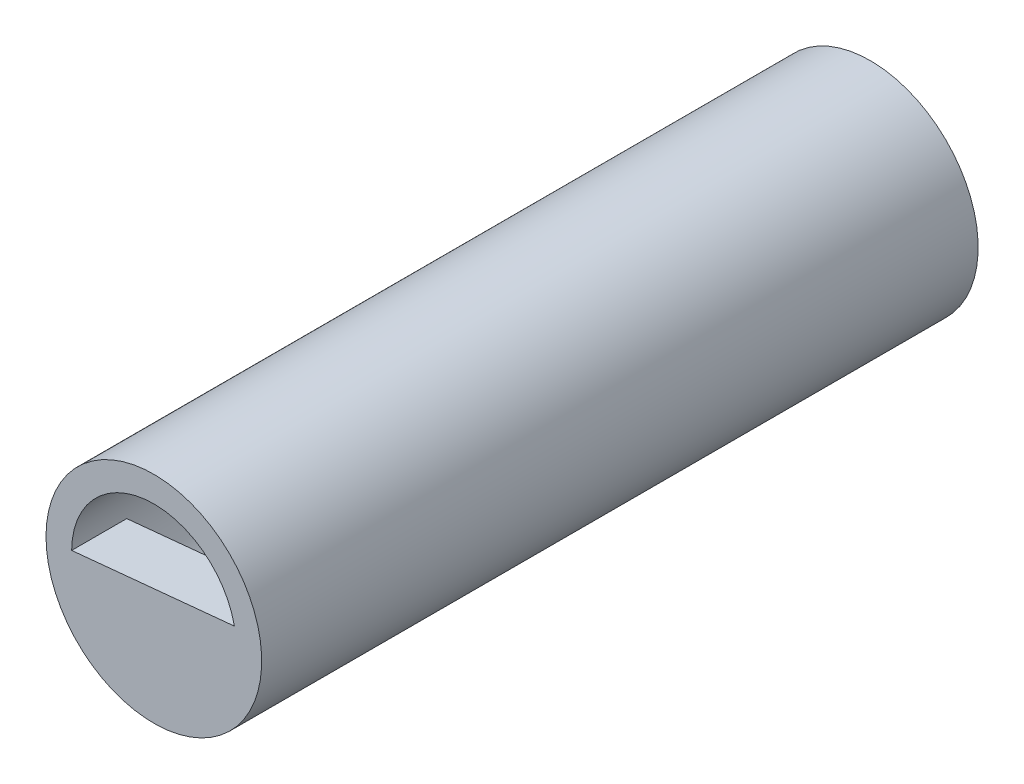
ISO-10303-21;
HEADER;
FILE_DESCRIPTION(('STEP AP214'),'2;1');
FILE_NAME('part.step','',(''),(''),'','','');
FILE_SCHEMA(('AUTOMOTIVE_DESIGN { 1 0 10303 214 1 1 1 1 }'));
ENDSEC;
DATA;
#1=APPLICATION_CONTEXT('core data for automotive mechanical design processes');
#2=APPLICATION_PROTOCOL_DEFINITION('international standard','automotive_design',2000,#1);
#3=PRODUCT_CONTEXT('',#1,'mechanical');
#4=PRODUCT('Part','Part','',(#3));
#5=PRODUCT_RELATED_PRODUCT_CATEGORY('part','',(#4));
#6=PRODUCT_DEFINITION_FORMATION('','',#4);
#7=PRODUCT_DEFINITION_CONTEXT('part definition',#1,'design');
#8=PRODUCT_DEFINITION('design','',#6,#7);
#9=PRODUCT_DEFINITION_SHAPE('','',#8);
#10=(LENGTH_UNIT() NAMED_UNIT(*) SI_UNIT(.MILLI.,.METRE.));
#11=(NAMED_UNIT(*) PLANE_ANGLE_UNIT() SI_UNIT($,.RADIAN.));
#12=(NAMED_UNIT(*) SI_UNIT($,.STERADIAN.) SOLID_ANGLE_UNIT());
#13=UNCERTAINTY_MEASURE_WITH_UNIT(LENGTH_MEASURE(1.E-05),#10,'distance_accuracy_value','');
#14=(GEOMETRIC_REPRESENTATION_CONTEXT(3) GLOBAL_UNCERTAINTY_ASSIGNED_CONTEXT((#13)) GLOBAL_UNIT_ASSIGNED_CONTEXT((#10,
#11,#12)) REPRESENTATION_CONTEXT('',''));
#15=CARTESIAN_POINT('',(0.,0.,0.));
#16=DIRECTION('',(0.,0.,1.));
#17=DIRECTION('',(1.,0.,0.));
#18=AXIS2_PLACEMENT_3D('',#15,#16,#17);
#19=CARTESIAN_POINT('',(0.,0.,304.8));
#20=DIRECTION('',(0.,0.,1.));
#21=DIRECTION('',(1.,0.,0.));
#22=AXIS2_PLACEMENT_3D('',#19,#20,#21);
#23=PLANE('',#22);
#24=CARTESIAN_POINT('',(0.,0.,304.8));
#25=DIRECTION('',(0.,0.,1.));
#26=DIRECTION('',(1.,0.,0.));
#27=AXIS2_PLACEMENT_3D('',#24,#25,#26);
#28=CIRCLE('',#27,49.7047479179537);
#29=CARTESIAN_POINT('',(-49.7047479179537,0.,304.8));
#30=VERTEX_POINT('',#29);
#31=EDGE_CURVE('E11',#30,#30,#28,.T.);
#32=ORIENTED_EDGE('',*,*,#31,.T.);
#33=EDGE_LOOP('',(#32));
#34=FACE_BOUND('',#33,.T.);
#35=CARTESIAN_POINT('',(0.,0.,304.8));
#36=DIRECTION('',(0.,0.,1.));
#37=DIRECTION('',(1.,0.,0.));
#38=AXIS2_PLACEMENT_3D('',#35,#36,#37);
#39=CIRCLE('',#38,37.8963787723686);
#40=CARTESIAN_POINT('',(37.1168710063061,7.64679087984369,304.8));
#41=VERTEX_POINT('',#40);
#42=CARTESIAN_POINT('',(-37.894810183845,0.344797316092374,304.8));
#43=VERTEX_POINT('',#42);
#44=EDGE_CURVE('E53',#41,#43,#39,.T.);
#45=ORIENTED_EDGE('',*,*,#44,.F.);
#46=DIRECTION('',(-0.99529540880386,-0.0968867855486918,0.));
#47=VECTOR('',#46,1.);
#48=CARTESIAN_POINT('',(-0.388969588769448,3.99579409796803,304.8));
#49=LINE('',#48,#47);
#50=EDGE_CURVE('E73',#41,#43,#49,.T.);
#51=ORIENTED_EDGE('',*,*,#50,.T.);
#52=EDGE_LOOP('',(#45,#51));
#53=FACE_BOUND('',#52,.T.);
#54=ADVANCED_FACE('F45',(#34,#53),#23,.T.);
#55=CARTESIAN_POINT('',(0.,0.,304.8));
#56=DIRECTION('',(0.,0.,-1.));
#57=DIRECTION('',(-1.,0.,0.));
#58=AXIS2_PLACEMENT_3D('',#55,#56,#57);
#59=CYLINDRICAL_SURFACE('',#58,49.7047479179537);
#60=CARTESIAN_POINT('',(0.,0.,-25.4));
#61=DIRECTION('',(0.,0.,-1.));
#62=DIRECTION('',(-1.,0.,0.));
#63=AXIS2_PLACEMENT_3D('',#60,#61,#62);
#64=CIRCLE('',#63,49.7047479179537);
#65=CARTESIAN_POINT('',(-49.7047479179537,0.,-25.4));
#66=VERTEX_POINT('',#65);
#67=EDGE_CURVE('E89',#66,#66,#64,.T.);
#68=CARTESIAN_POINT('',(-49.7047479179537,0.,304.8));
#69=CARTESIAN_POINT('',(-49.7047479179537,0.,301.360416666667));
#70=CARTESIAN_POINT('',(-49.7047479179537,0.,297.920833333333));
#71=CARTESIAN_POINT('',(-49.7047479179537,0.,291.041666666667));
#72=CARTESIAN_POINT('',(-49.7047479179537,0.,287.602083333333));
#73=CARTESIAN_POINT('',(-49.7047479179537,0.,280.722916666667));
#74=CARTESIAN_POINT('',(-49.7047479179537,0.,277.283333333333));
#75=CARTESIAN_POINT('',(-49.7047479179537,0.,270.404166666667));
#76=CARTESIAN_POINT('',(-49.7047479179537,0.,266.964583333333));
#77=CARTESIAN_POINT('',(-49.7047479179537,0.,260.085416666667));
#78=CARTESIAN_POINT('',(-49.7047479179537,0.,256.645833333333));
#79=CARTESIAN_POINT('',(-49.7047479179537,0.,249.766666666667));
#80=CARTESIAN_POINT('',(-49.7047479179537,0.,246.327083333333));
#81=CARTESIAN_POINT('',(-49.7047479179537,0.,239.447916666667));
#82=CARTESIAN_POINT('',(-49.7047479179537,0.,236.008333333333));
#83=CARTESIAN_POINT('',(-49.7047479179537,0.,229.129166666667));
#84=CARTESIAN_POINT('',(-49.7047479179537,0.,225.689583333333));
#85=CARTESIAN_POINT('',(-49.7047479179537,0.,218.810416666667));
#86=CARTESIAN_POINT('',(-49.7047479179537,0.,215.370833333333));
#87=CARTESIAN_POINT('',(-49.7047479179537,0.,208.491666666667));
#88=CARTESIAN_POINT('',(-49.7047479179537,0.,205.052083333333));
#89=CARTESIAN_POINT('',(-49.7047479179537,0.,198.172916666667));
#90=CARTESIAN_POINT('',(-49.7047479179537,0.,194.733333333333));
#91=CARTESIAN_POINT('',(-49.7047479179537,0.,187.854166666667));
#92=CARTESIAN_POINT('',(-49.7047479179537,0.,184.414583333333));
#93=CARTESIAN_POINT('',(-49.7047479179537,0.,177.535416666667));
#94=CARTESIAN_POINT('',(-49.7047479179537,0.,174.095833333333));
#95=CARTESIAN_POINT('',(-49.7047479179537,0.,167.216666666667));
#96=CARTESIAN_POINT('',(-49.7047479179537,0.,163.777083333333));
#97=CARTESIAN_POINT('',(-49.7047479179537,0.,156.897916666667));
#98=CARTESIAN_POINT('',(-49.7047479179537,0.,153.458333333333));
#99=CARTESIAN_POINT('',(-49.7047479179537,0.,146.579166666667));
#100=CARTESIAN_POINT('',(-49.7047479179537,0.,143.139583333333));
#101=CARTESIAN_POINT('',(-49.7047479179537,0.,136.260416666667));
#102=CARTESIAN_POINT('',(-49.7047479179537,0.,132.820833333333));
#103=CARTESIAN_POINT('',(-49.7047479179537,0.,125.941666666667));
#104=CARTESIAN_POINT('',(-49.7047479179537,0.,122.502083333333));
#105=CARTESIAN_POINT('',(-49.7047479179537,0.,115.622916666667));
#106=CARTESIAN_POINT('',(-49.7047479179537,0.,112.183333333333));
#107=CARTESIAN_POINT('',(-49.7047479179537,0.,105.304166666667));
#108=CARTESIAN_POINT('',(-49.7047479179537,0.,101.864583333333));
#109=CARTESIAN_POINT('',(-49.7047479179537,0.,94.9854166666667));
#110=CARTESIAN_POINT('',(-49.7047479179537,0.,91.5458333333333));
#111=CARTESIAN_POINT('',(-49.7047479179537,0.,84.6666666666667));
#112=CARTESIAN_POINT('',(-49.7047479179537,0.,81.2270833333333));
#113=CARTESIAN_POINT('',(-49.7047479179537,0.,74.3479166666666));
#114=CARTESIAN_POINT('',(-49.7047479179537,0.,70.9083333333333));
#115=CARTESIAN_POINT('',(-49.7047479179537,0.,64.0291666666666));
#116=CARTESIAN_POINT('',(-49.7047479179537,0.,60.5895833333333));
#117=CARTESIAN_POINT('',(-49.7047479179537,0.,53.7104166666667));
#118=CARTESIAN_POINT('',(-49.7047479179537,0.,50.2708333333334));
#119=CARTESIAN_POINT('',(-49.7047479179537,0.,43.3916666666667));
#120=CARTESIAN_POINT('',(-49.7047479179537,0.,39.9520833333334));
#121=CARTESIAN_POINT('',(-49.7047479179537,0.,33.0729166666667));
#122=CARTESIAN_POINT('',(-49.7047479179537,0.,29.6333333333334));
#123=CARTESIAN_POINT('',(-49.7047479179537,0.,22.7541666666667));
#124=CARTESIAN_POINT('',(-49.7047479179537,0.,19.3145833333334));
#125=CARTESIAN_POINT('',(-49.7047479179537,0.,12.4354166666667));
#126=CARTESIAN_POINT('',(-49.7047479179537,0.,8.99583333333337));
#127=CARTESIAN_POINT('',(-49.7047479179537,0.,2.11666666666669));
#128=CARTESIAN_POINT('',(-49.7047479179537,0.,-1.32291666666666));
#129=CARTESIAN_POINT('',(-49.7047479179537,0.,-8.20208333333333));
#130=CARTESIAN_POINT('',(-49.7047479179537,0.,-11.6416666666667));
#131=CARTESIAN_POINT('',(-49.7047479179537,0.,-18.5208333333333));
#132=CARTESIAN_POINT('',(-49.7047479179537,0.,-21.9604166666666));
#133=CARTESIAN_POINT('',(-49.7047479179537,0.,-25.4));
#134=B_SPLINE_CURVE_WITH_KNOTS('',3,(#68,#69,#70,#71,#72,#73,#74,#75,#76,#77,#78,#79,#80,#81,
#82,#83,#84,#85,#86,#87,#88,#89,#90,#91,#92,#93,#94,#95,#96,#97,#98,#99,#100,#101,#102,#103,
#104,#105,#106,#107,#108,#109,#110,#111,#112,#113,#114,#115,#116,#117,#118,#119,#120,#121,#122,
#123,#124,#125,#126,#127,#128,#129,#130,#131,#132,#133),.UNSPECIFIED.,.F.,.F.,(4,2,2,2,2,2,2,2,
2,2,2,2,2,2,2,2,2,2,2,2,2,2,2,2,2,2,2,2,2,2,2,2,4),(0.,10.31875,20.6375,30.95625,41.275,
51.59375,61.9125,72.23125,82.55,92.86875,103.1875,113.50625,123.825,134.14375,144.4625,
154.78125,165.1,175.41875,185.7375,196.05625,206.375,216.69375,227.0125,237.33125,247.65,
257.96875,268.2875,278.60625,288.925,299.24375,309.5625,319.88125,330.2),.UNSPECIFIED.);
#135=EDGE_CURVE('BSEAM47',#30,#66,#134,.T.);
#136=ORIENTED_EDGE('',*,*,#31,.F.);
#137=ORIENTED_EDGE('',*,*,#67,.F.);
#138=ORIENTED_EDGE('',*,*,#135,.T.);
#139=ORIENTED_EDGE('',*,*,#135,.F.);
#140=EDGE_LOOP('',(#136,#138,#137,#139));
#141=FACE_BOUND('',#140,.T.);
#142=ADVANCED_FACE('F47',(#141),#59,.T.);
#143=CARTESIAN_POINT('',(0.,0.,304.8));
#144=DIRECTION('',(0.,0.,-1.));
#145=DIRECTION('',(-1.,0.,0.));
#146=AXIS2_PLACEMENT_3D('',#143,#144,#145);
#147=CYLINDRICAL_SURFACE('',#146,37.8963787723686);
#148=DIRECTION('',(0.,0.,1.));
#149=VECTOR('',#148,1.);
#150=CARTESIAN_POINT('',(37.1168710063061,7.64679087984369,279.4));
#151=LINE('',#150,#149);
#152=CARTESIAN_POINT('',(37.1168710063061,7.64679087984368,279.4));
#153=VERTEX_POINT('',#152);
#154=EDGE_CURVE('E76',#153,#41,#151,.T.);
#155=ORIENTED_EDGE('',*,*,#154,.T.);
#156=ORIENTED_EDGE('',*,*,#44,.T.);
#157=DIRECTION('',(0.,0.,1.));
#158=VECTOR('',#157,1.);
#159=CARTESIAN_POINT('',(-37.894810183845,0.344797316092374,279.4));
#160=LINE('',#159,#158);
#161=CARTESIAN_POINT('',(-37.894810183845,0.344797316092374,279.4));
#162=VERTEX_POINT('',#161);
#163=EDGE_CURVE('E65',#162,#43,#160,.T.);
#164=ORIENTED_EDGE('',*,*,#163,.F.);
#165=CARTESIAN_POINT('',(0.,0.,279.4));
#166=DIRECTION('',(0.,0.,1.));
#167=DIRECTION('',(1.,0.,0.));
#168=AXIS2_PLACEMENT_3D('',#165,#166,#167);
#169=CIRCLE('',#168,37.8963787723686);
#170=EDGE_CURVE('E60',#153,#162,#169,.F.);
#171=ORIENTED_EDGE('',*,*,#170,.F.);
#172=EDGE_LOOP('',(#155,#156,#164,#171));
#173=FACE_BOUND('',#172,.T.);
#174=CARTESIAN_POINT('',(0.,0.,0.));
#175=DIRECTION('',(0.,0.,1.));
#176=DIRECTION('',(1.,0.,0.));
#177=AXIS2_PLACEMENT_3D('',#174,#175,#176);
#178=CIRCLE('',#177,37.8963787723686);
#179=CARTESIAN_POINT('',(37.8963787723686,0.,0.));
#180=VERTEX_POINT('',#179);
#181=EDGE_CURVE('E74',#180,#180,#178,.T.);
#182=ORIENTED_EDGE('',*,*,#181,.F.);
#183=EDGE_LOOP('',(#182));
#184=FACE_BOUND('',#183,.T.);
#185=ADVANCED_FACE('F77',(#173,#184),#147,.F.);
#186=CARTESIAN_POINT('',(0.,0.,0.));
#187=DIRECTION('',(0.,0.,-1.));
#188=DIRECTION('',(-1.,0.,0.));
#189=AXIS2_PLACEMENT_3D('',#186,#187,#188);
#190=PLANE('',#189);
#191=ORIENTED_EDGE('',*,*,#181,.T.);
#192=EDGE_LOOP('',(#191));
#193=FACE_BOUND('',#192,.T.);
#194=ADVANCED_FACE('F95',(#193),#190,.F.);
#195=CARTESIAN_POINT('',(0.,0.,-25.4));
#196=DIRECTION('',(0.,0.,-1.));
#197=DIRECTION('',(-1.,0.,0.));
#198=AXIS2_PLACEMENT_3D('',#195,#196,#197);
#199=PLANE('',#198);
#200=ORIENTED_EDGE('',*,*,#67,.T.);
#201=EDGE_LOOP('',(#200));
#202=FACE_BOUND('',#201,.T.);
#203=ADVANCED_FACE('F103',(#202),#199,.T.);
#204=CARTESIAN_POINT('',(-0.388969588769448,3.99579409796803,279.4));
#205=DIRECTION('',(-0.0968867855486918,0.99529540880386,0.));
#206=DIRECTION('',(-0.99529540880386,-0.0968867855486918,0.));
#207=AXIS2_PLACEMENT_3D('',#204,#205,#206);
#208=PLANE('',#207);
#209=ORIENTED_EDGE('',*,*,#50,.F.);
#210=ORIENTED_EDGE('',*,*,#154,.F.);
#211=DIRECTION('',(-0.99529540880386,-0.0968867855486918,0.));
#212=VECTOR('',#211,1.);
#213=CARTESIAN_POINT('',(-0.388969588769448,3.99579409796803,279.4));
#214=LINE('',#213,#212);
#215=EDGE_CURVE('E82',#153,#162,#214,.T.);
#216=ORIENTED_EDGE('',*,*,#215,.T.);
#217=ORIENTED_EDGE('',*,*,#163,.T.);
#218=EDGE_LOOP('',(#209,#210,#216,#217));
#219=FACE_BOUND('',#218,.T.);
#220=ADVANCED_FACE('F84',(#219),#208,.T.);
#221=CARTESIAN_POINT('',(0.,0.,279.4));
#222=DIRECTION('',(0.,0.,1.));
#223=DIRECTION('',(1.,0.,0.));
#224=AXIS2_PLACEMENT_3D('',#221,#222,#223);
#225=PLANE('',#224);
#226=ORIENTED_EDGE('',*,*,#170,.T.);
#227=ORIENTED_EDGE('',*,*,#215,.F.);
#228=EDGE_LOOP('',(#226,#227));
#229=FACE_BOUND('',#228,.T.);
#230=ADVANCED_FACE('F119',(#229),#225,.F.);
#231=CLOSED_SHELL('',(#54,#142,#185,#194,#203,#220,#230));
#232=MANIFOLD_SOLID_BREP('B2',#231);
#233=ADVANCED_BREP_SHAPE_REPRESENTATION('',(#18,#232),#14);
#234=SHAPE_DEFINITION_REPRESENTATION(#9,#233);
ENDSEC;
END-ISO-10303-21;
